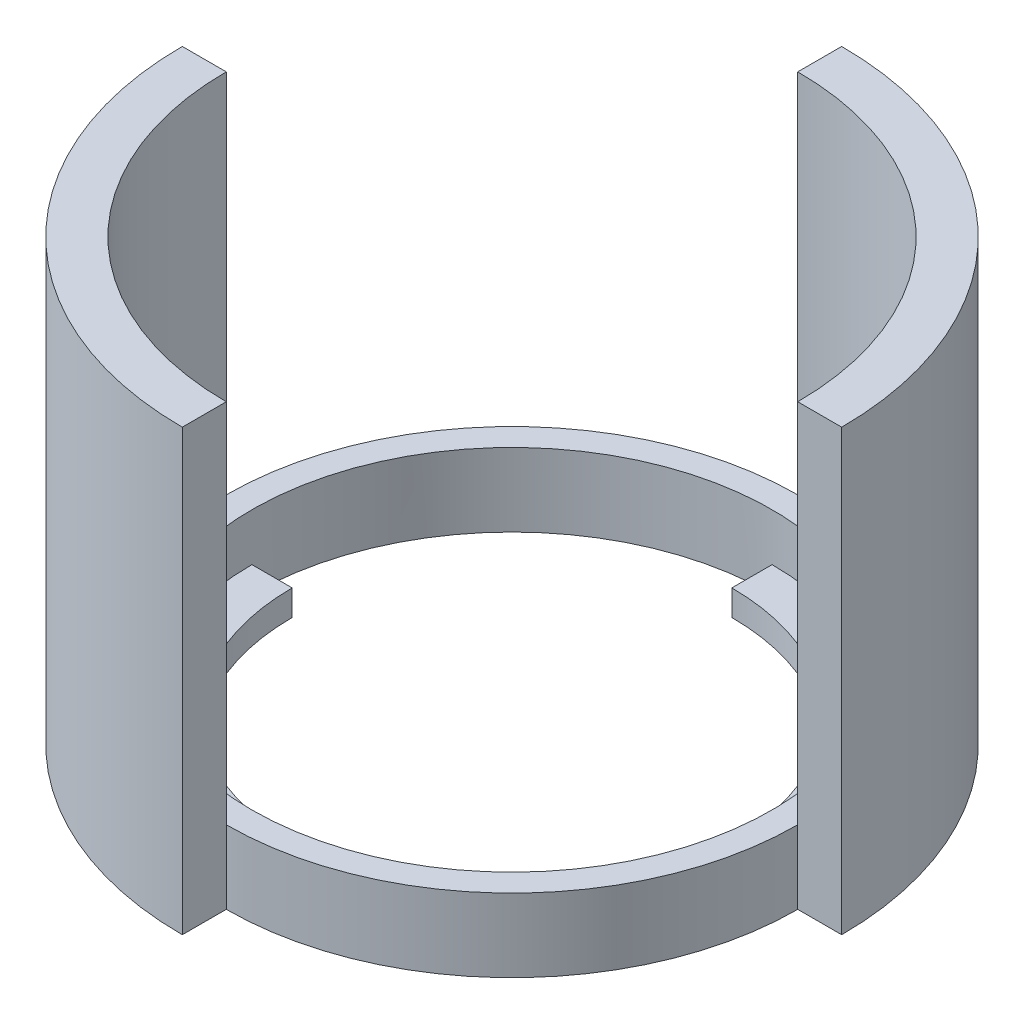
ISO-10303-21;
HEADER;
FILE_DESCRIPTION(('STEP AP214'),'2;1');
FILE_NAME('part.step','',(''),(''),'','','');
FILE_SCHEMA(('AUTOMOTIVE_DESIGN { 1 0 10303 214 1 1 1 1 }'));
ENDSEC;
DATA;
#1=APPLICATION_CONTEXT('core data for automotive mechanical design processes');
#2=APPLICATION_PROTOCOL_DEFINITION('international standard','automotive_design',2000,#1);
#3=PRODUCT_CONTEXT('',#1,'mechanical');
#4=PRODUCT('Part','Part','',(#3));
#5=PRODUCT_RELATED_PRODUCT_CATEGORY('part','',(#4));
#6=PRODUCT_DEFINITION_FORMATION('','',#4);
#7=PRODUCT_DEFINITION_CONTEXT('part definition',#1,'design');
#8=PRODUCT_DEFINITION('design','',#6,#7);
#9=PRODUCT_DEFINITION_SHAPE('','',#8);
#10=(LENGTH_UNIT() NAMED_UNIT(*) SI_UNIT(.MILLI.,.METRE.));
#11=(NAMED_UNIT(*) PLANE_ANGLE_UNIT() SI_UNIT($,.RADIAN.));
#12=(NAMED_UNIT(*) SI_UNIT($,.STERADIAN.) SOLID_ANGLE_UNIT());
#13=UNCERTAINTY_MEASURE_WITH_UNIT(LENGTH_MEASURE(1.E-05),#10,'distance_accuracy_value','');
#14=(GEOMETRIC_REPRESENTATION_CONTEXT(3) GLOBAL_UNCERTAINTY_ASSIGNED_CONTEXT((#13)) GLOBAL_UNIT_ASSIGNED_CONTEXT((#10,
#11,#12)) REPRESENTATION_CONTEXT('',''));
#15=CARTESIAN_POINT('',(0.,0.,0.));
#16=DIRECTION('',(0.,0.,1.));
#17=DIRECTION('',(1.,0.,0.));
#18=AXIS2_PLACEMENT_3D('',#15,#16,#17);
#19=CARTESIAN_POINT('',(0.,-5.,0.));
#20=DIRECTION('',(0.,1.,0.));
#21=DIRECTION('',(0.,0.,1.));
#22=AXIS2_PLACEMENT_3D('',#19,#20,#21);
#23=CYLINDRICAL_SURFACE('',#22,35.5);
#24=CARTESIAN_POINT('',(0.,5.,0.));
#25=DIRECTION('',(0.,1.,0.));
#26=DIRECTION('',(0.,0.,1.));
#27=AXIS2_PLACEMENT_3D('',#24,#25,#26);
#28=CIRCLE('',#27,35.5);
#29=CARTESIAN_POINT('',(0.,5.,35.5));
#30=VERTEX_POINT('',#29);
#31=EDGE_CURVE('E316',#30,#30,#28,.T.);
#32=ORIENTED_EDGE('',*,*,#31,.T.);
#33=EDGE_LOOP('',(#32));
#34=FACE_BOUND('',#33,.T.);
#35=DIRECTION('',(0.,-1.,0.));
#36=VECTOR('',#35,1.);
#37=CARTESIAN_POINT('',(35.5,-1.5,0.));
#38=LINE('',#37,#36);
#39=CARTESIAN_POINT('',(35.5,-1.5,0.));
#40=VERTEX_POINT('',#39);
#41=CARTESIAN_POINT('',(35.5,-5.,0.));
#42=VERTEX_POINT('',#41);
#43=EDGE_CURVE('E236',#40,#42,#38,.T.);
#44=ORIENTED_EDGE('',*,*,#43,.T.);
#45=CARTESIAN_POINT('',(0.,-5.,0.));
#46=DIRECTION('',(0.,1.,0.));
#47=DIRECTION('',(0.,0.,1.));
#48=AXIS2_PLACEMENT_3D('',#45,#46,#47);
#49=CIRCLE('',#48,35.5);
#50=CARTESIAN_POINT('',(-1.23947587528931E-13,-5.,35.5));
#51=VERTEX_POINT('',#50);
#52=EDGE_CURVE('E324',#51,#42,#49,.T.);
#53=ORIENTED_EDGE('',*,*,#52,.F.);
#54=DIRECTION('',(0.,-1.,0.));
#55=VECTOR('',#54,1.);
#56=CARTESIAN_POINT('',(-1.23947587528931E-13,-1.5,35.5));
#57=LINE('',#56,#55);
#58=CARTESIAN_POINT('',(-1.23947587528931E-13,-1.5,35.5));
#59=VERTEX_POINT('',#58);
#60=EDGE_CURVE('E320',#59,#51,#57,.T.);
#61=ORIENTED_EDGE('',*,*,#60,.F.);
#62=CARTESIAN_POINT('',(0.,-1.5,0.));
#63=DIRECTION('',(0.,-1.,0.));
#64=DIRECTION('',(0.,0.,-1.));
#65=AXIS2_PLACEMENT_3D('',#62,#63,#64);
#66=CIRCLE('',#65,35.5);
#67=CARTESIAN_POINT('',(-17.7499999999998,-1.5,30.7439018343477));
#68=VERTEX_POINT('',#67);
#69=EDGE_CURVE('E302',#68,#59,#66,.F.);
#70=ORIENTED_EDGE('',*,*,#69,.F.);
#71=DIRECTION('',(0.,-1.,0.));
#72=VECTOR('',#71,1.);
#73=CARTESIAN_POINT('',(-17.7499999999998,-1.5,30.7439018343477));
#74=LINE('',#73,#72);
#75=CARTESIAN_POINT('',(-17.7499999999998,-5.,30.7439018343477));
#76=VERTEX_POINT('',#75);
#77=EDGE_CURVE('E317',#68,#76,#74,.T.);
#78=ORIENTED_EDGE('',*,*,#77,.T.);
#79=CARTESIAN_POINT('',(-30.7439018343476,-5.,17.75));
#80=VERTEX_POINT('',#79);
#81=EDGE_CURVE('E329',#80,#76,#49,.T.);
#82=ORIENTED_EDGE('',*,*,#81,.F.);
#83=DIRECTION('',(0.,-1.,0.));
#84=VECTOR('',#83,1.);
#85=CARTESIAN_POINT('',(-30.7439018343475,-1.5,17.75));
#86=LINE('',#85,#84);
#87=CARTESIAN_POINT('',(-30.7439018343475,-1.5,17.75));
#88=VERTEX_POINT('',#87);
#89=EDGE_CURVE('E291',#88,#80,#86,.T.);
#90=ORIENTED_EDGE('',*,*,#89,.F.);
#91=CARTESIAN_POINT('',(0.,-1.5,0.));
#92=DIRECTION('',(0.,-1.,0.));
#93=DIRECTION('',(0.,0.,-1.));
#94=AXIS2_PLACEMENT_3D('',#91,#92,#93);
#95=CIRCLE('',#94,35.5);
#96=CARTESIAN_POINT('',(-35.5,-1.5,0.));
#97=VERTEX_POINT('',#96);
#98=EDGE_CURVE('E273',#97,#88,#95,.F.);
#99=ORIENTED_EDGE('',*,*,#98,.F.);
#100=DIRECTION('',(0.,-1.,0.));
#101=VECTOR('',#100,1.);
#102=CARTESIAN_POINT('',(-35.5,-1.5,0.));
#103=LINE('',#102,#101);
#104=CARTESIAN_POINT('',(-35.5,-5.,0.));
#105=VERTEX_POINT('',#104);
#106=EDGE_CURVE('E288',#97,#105,#103,.T.);
#107=ORIENTED_EDGE('',*,*,#106,.T.);
#108=CARTESIAN_POINT('',(0.,-5.,-35.5));
#109=VERTEX_POINT('',#108);
#110=EDGE_CURVE('E772',#109,#105,#49,.T.);
#111=ORIENTED_EDGE('',*,*,#110,.F.);
#112=DIRECTION('',(0.,-1.,0.));
#113=VECTOR('',#112,1.);
#114=CARTESIAN_POINT('',(0.,-1.5,-35.5));
#115=LINE('',#114,#113);
#116=CARTESIAN_POINT('',(0.,-1.5,-35.5));
#117=VERTEX_POINT('',#116);
#118=EDGE_CURVE('E263',#117,#109,#115,.T.);
#119=ORIENTED_EDGE('',*,*,#118,.F.);
#120=CARTESIAN_POINT('',(0.,-1.5,0.));
#121=DIRECTION('',(0.,-1.,0.));
#122=DIRECTION('',(0.,0.,-1.));
#123=AXIS2_PLACEMENT_3D('',#120,#121,#122);
#124=CIRCLE('',#123,35.5);
#125=CARTESIAN_POINT('',(17.7499999999998,-1.5,-30.7439018343477));
#126=VERTEX_POINT('',#125);
#127=EDGE_CURVE('E246',#126,#117,#124,.F.);
#128=ORIENTED_EDGE('',*,*,#127,.F.);
#129=DIRECTION('',(0.,-1.,0.));
#130=VECTOR('',#129,1.);
#131=CARTESIAN_POINT('',(17.7499999999998,-1.5,-30.7439018343477));
#132=LINE('',#131,#130);
#133=CARTESIAN_POINT('',(17.7499999999998,-5.,-30.7439018343477));
#134=VERTEX_POINT('',#133);
#135=EDGE_CURVE('E260',#126,#134,#132,.T.);
#136=ORIENTED_EDGE('',*,*,#135,.T.);
#137=CARTESIAN_POINT('',(30.7439018343476,-5.,-17.75));
#138=VERTEX_POINT('',#137);
#139=EDGE_CURVE('E328',#138,#134,#49,.T.);
#140=ORIENTED_EDGE('',*,*,#139,.F.);
#141=DIRECTION('',(0.,-1.,0.));
#142=VECTOR('',#141,1.);
#143=CARTESIAN_POINT('',(30.7439018343476,-1.5,-17.75));
#144=LINE('',#143,#142);
#145=CARTESIAN_POINT('',(30.7439018343476,-1.5,-17.75));
#146=VERTEX_POINT('',#145);
#147=EDGE_CURVE('E211',#146,#138,#144,.T.);
#148=ORIENTED_EDGE('',*,*,#147,.F.);
#149=CARTESIAN_POINT('',(0.,-1.5,0.));
#150=DIRECTION('',(0.,-1.,0.));
#151=DIRECTION('',(0.,0.,-1.));
#152=AXIS2_PLACEMENT_3D('',#149,#150,#151);
#153=CIRCLE('',#152,35.5);
#154=EDGE_CURVE('E225',#40,#146,#153,.F.);
#155=ORIENTED_EDGE('',*,*,#154,.F.);
#156=EDGE_LOOP('',(#44,#53,#61,#70,#78,#82,#90,#99,#107,#111,#119,#128,#136,#140,#148,#155));
#157=FACE_BOUND('',#156,.T.);
#158=ADVANCED_FACE('F31',(#34,#157),#23,.F.);
#159=CARTESIAN_POINT('',(0.,5.,0.));
#160=DIRECTION('',(0.,-1.,0.));
#161=DIRECTION('',(0.,0.,-1.));
#162=AXIS2_PLACEMENT_3D('',#159,#160,#161);
#163=CYLINDRICAL_SURFACE('',#162,39.);
#164=DIRECTION('',(0.,-1.,0.));
#165=VECTOR('',#164,1.);
#166=CARTESIAN_POINT('',(39.,55.,0.));
#167=LINE('',#166,#165);
#168=CARTESIAN_POINT('',(39.,5.,0.));
#169=VERTEX_POINT('',#168);
#170=CARTESIAN_POINT('',(39.,-5.,0.));
#171=VERTEX_POINT('',#170);
#172=EDGE_CURVE('E365',#169,#171,#167,.T.);
#173=ORIENTED_EDGE('',*,*,#172,.F.);
#174=CARTESIAN_POINT('',(0.,5.,0.));
#175=DIRECTION('',(0.,1.,0.));
#176=DIRECTION('',(0.,0.,1.));
#177=AXIS2_PLACEMENT_3D('',#174,#175,#176);
#178=CIRCLE('',#177,39.);
#179=CARTESIAN_POINT('',(0.,5.,39.));
#180=VERTEX_POINT('',#179);
#181=EDGE_CURVE('E11',#180,#169,#178,.T.);
#182=ORIENTED_EDGE('',*,*,#181,.F.);
#183=DIRECTION('',(0.,1.,0.));
#184=VECTOR('',#183,1.);
#185=CARTESIAN_POINT('',(0.,0.,39.));
#186=LINE('',#185,#184);
#187=CARTESIAN_POINT('',(0.,-5.,39.));
#188=VERTEX_POINT('',#187);
#189=EDGE_CURVE('E398',#188,#180,#186,.T.);
#190=ORIENTED_EDGE('',*,*,#189,.F.);
#191=CARTESIAN_POINT('',(0.,-5.,0.));
#192=DIRECTION('',(0.,-1.,0.));
#193=DIRECTION('',(0.,0.,-1.));
#194=AXIS2_PLACEMENT_3D('',#191,#192,#193);
#195=CIRCLE('',#194,39.);
#196=EDGE_CURVE('E349',#171,#188,#195,.T.);
#197=ORIENTED_EDGE('',*,*,#196,.F.);
#198=EDGE_LOOP('',(#173,#182,#190,#197));
#199=FACE_BOUND('',#198,.T.);
#200=ADVANCED_FACE('F33',(#199),#163,.T.);
#201=DIRECTION('',(0.,-1.,0.));
#202=VECTOR('',#201,1.);
#203=CARTESIAN_POINT('',(0.,55.,-39.));
#204=LINE('',#203,#202);
#205=CARTESIAN_POINT('',(0.,5.,-39.));
#206=VERTEX_POINT('',#205);
#207=CARTESIAN_POINT('',(0.,-5.,-39.));
#208=VERTEX_POINT('',#207);
#209=EDGE_CURVE('E369',#206,#208,#204,.T.);
#210=ORIENTED_EDGE('',*,*,#209,.T.);
#211=CARTESIAN_POINT('',(0.,-5.,0.));
#212=DIRECTION('',(0.,-1.,0.));
#213=DIRECTION('',(0.,0.,-1.));
#214=AXIS2_PLACEMENT_3D('',#211,#212,#213);
#215=CIRCLE('',#214,39.);
#216=CARTESIAN_POINT('',(-39.,-5.,0.));
#217=VERTEX_POINT('',#216);
#218=EDGE_CURVE('E337',#217,#208,#215,.T.);
#219=ORIENTED_EDGE('',*,*,#218,.F.);
#220=DIRECTION('',(0.,1.,0.));
#221=VECTOR('',#220,1.);
#222=CARTESIAN_POINT('',(-39.,0.,0.));
#223=LINE('',#222,#221);
#224=CARTESIAN_POINT('',(-39.,5.,0.));
#225=VERTEX_POINT('',#224);
#226=EDGE_CURVE('E393',#217,#225,#223,.T.);
#227=ORIENTED_EDGE('',*,*,#226,.T.);
#228=EDGE_CURVE('E39',#206,#225,#178,.T.);
#229=ORIENTED_EDGE('',*,*,#228,.F.);
#230=EDGE_LOOP('',(#210,#219,#227,#229));
#231=FACE_BOUND('',#230,.T.);
#232=ADVANCED_FACE('F412',(#231),#163,.T.);
#233=CARTESIAN_POINT('',(0.,5.,0.));
#234=DIRECTION('',(0.,1.,0.));
#235=DIRECTION('',(0.,0.,1.));
#236=AXIS2_PLACEMENT_3D('',#233,#234,#235);
#237=PLANE('',#236);
#238=ORIENTED_EDGE('',*,*,#31,.F.);
#239=EDGE_LOOP('',(#238));
#240=FACE_BOUND('',#239,.T.);
#241=ORIENTED_EDGE('',*,*,#181,.T.);
#242=CARTESIAN_POINT('',(0.,5.,0.));
#243=DIRECTION('',(0.,1.,0.));
#244=DIRECTION('',(0.,0.,1.));
#245=AXIS2_PLACEMENT_3D('',#242,#243,#244);
#246=CIRCLE('',#245,39.);
#247=EDGE_CURVE('E377',#206,#169,#246,.F.);
#248=ORIENTED_EDGE('',*,*,#247,.F.);
#249=ORIENTED_EDGE('',*,*,#228,.T.);
#250=CARTESIAN_POINT('',(0.,5.,0.));
#251=DIRECTION('',(0.,1.,0.));
#252=DIRECTION('',(0.,0.,1.));
#253=AXIS2_PLACEMENT_3D('',#250,#251,#252);
#254=CIRCLE('',#253,39.);
#255=EDGE_CURVE('E396',#225,#180,#254,.T.);
#256=ORIENTED_EDGE('',*,*,#255,.T.);
#257=EDGE_LOOP('',(#241,#248,#249,#256));
#258=FACE_BOUND('',#257,.T.);
#259=ADVANCED_FACE('F408',(#240,#258),#237,.T.);
#260=CARTESIAN_POINT('',(-99.1414213562373,0.,0.));
#261=DIRECTION('',(0.,0.,1.));
#262=DIRECTION('',(1.,0.,0.));
#263=AXIS2_PLACEMENT_3D('',#260,#261,#262);
#264=PLANE('',#263);
#265=DIRECTION('',(1.,0.,0.));
#266=VECTOR('',#265,1.);
#267=CARTESIAN_POINT('',(-99.1414213562373,55.,0.));
#268=LINE('',#267,#266);
#269=CARTESIAN_POINT('',(-45.,55.,0.));
#270=VERTEX_POINT('',#269);
#271=CARTESIAN_POINT('',(-39.,55.,0.));
#272=VERTEX_POINT('',#271);
#273=EDGE_CURVE('E380',#270,#272,#268,.T.);
#274=ORIENTED_EDGE('',*,*,#273,.T.);
#275=EDGE_CURVE('E397',#225,#272,#223,.T.);
#276=ORIENTED_EDGE('',*,*,#275,.F.);
#277=ORIENTED_EDGE('',*,*,#226,.F.);
#278=DIRECTION('',(1.,0.,0.));
#279=VECTOR('',#278,1.);
#280=CARTESIAN_POINT('',(-45.,-5.,0.));
#281=LINE('',#280,#279);
#282=CARTESIAN_POINT('',(-45.,-5.,0.));
#283=VERTEX_POINT('',#282);
#284=EDGE_CURVE('E334',#283,#217,#281,.T.);
#285=ORIENTED_EDGE('',*,*,#284,.F.);
#286=DIRECTION('',(0.,1.,0.));
#287=VECTOR('',#286,1.);
#288=CARTESIAN_POINT('',(-45.,0.,0.));
#289=LINE('',#288,#287);
#290=EDGE_CURVE('E392',#283,#270,#289,.T.);
#291=ORIENTED_EDGE('',*,*,#290,.T.);
#292=EDGE_LOOP('',(#274,#276,#277,#285,#291));
#293=FACE_BOUND('',#292,.T.);
#294=ADVANCED_FACE('F419',(#293),#264,.F.);
#295=CARTESIAN_POINT('',(0.,0.,0.));
#296=DIRECTION('',(0.,1.,0.));
#297=DIRECTION('',(0.,0.,1.));
#298=AXIS2_PLACEMENT_3D('',#295,#296,#297);
#299=CYLINDRICAL_SURFACE('',#298,39.);
#300=ORIENTED_EDGE('',*,*,#255,.F.);
#301=ORIENTED_EDGE('',*,*,#275,.T.);
#302=CARTESIAN_POINT('',(0.,55.,0.));
#303=DIRECTION('',(0.,1.,0.));
#304=DIRECTION('',(0.,0.,1.));
#305=AXIS2_PLACEMENT_3D('',#302,#303,#304);
#306=CIRCLE('',#305,39.);
#307=CARTESIAN_POINT('',(0.,55.,39.));
#308=VERTEX_POINT('',#307);
#309=EDGE_CURVE('E389',#272,#308,#306,.T.);
#310=ORIENTED_EDGE('',*,*,#309,.T.);
#311=EDGE_CURVE('E401',#180,#308,#186,.T.);
#312=ORIENTED_EDGE('',*,*,#311,.F.);
#313=EDGE_LOOP('',(#300,#301,#310,#312));
#314=FACE_BOUND('',#313,.T.);
#315=ADVANCED_FACE('F418',(#314),#299,.F.);
#316=CARTESIAN_POINT('',(0.,0.,0.));
#317=DIRECTION('',(-1.,0.,0.));
#318=DIRECTION('',(0.,0.,1.));
#319=AXIS2_PLACEMENT_3D('',#316,#317,#318);
#320=PLANE('',#319);
#321=DIRECTION('',(0.,0.,1.));
#322=VECTOR('',#321,1.);
#323=CARTESIAN_POINT('',(0.,55.,0.));
#324=LINE('',#323,#322);
#325=CARTESIAN_POINT('',(0.,55.,45.));
#326=VERTEX_POINT('',#325);
#327=EDGE_CURVE('E386',#308,#326,#324,.T.);
#328=ORIENTED_EDGE('',*,*,#327,.T.);
#329=DIRECTION('',(0.,1.,0.));
#330=VECTOR('',#329,1.);
#331=CARTESIAN_POINT('',(0.,0.,45.));
#332=LINE('',#331,#330);
#333=CARTESIAN_POINT('',(0.,-5.,45.));
#334=VERTEX_POINT('',#333);
#335=EDGE_CURVE('E402',#334,#326,#332,.T.);
#336=ORIENTED_EDGE('',*,*,#335,.F.);
#337=DIRECTION('',(0.,0.,1.));
#338=VECTOR('',#337,1.);
#339=CARTESIAN_POINT('',(0.,-5.,45.));
#340=LINE('',#339,#338);
#341=EDGE_CURVE('E352',#188,#334,#340,.T.);
#342=ORIENTED_EDGE('',*,*,#341,.F.);
#343=ORIENTED_EDGE('',*,*,#189,.T.);
#344=ORIENTED_EDGE('',*,*,#311,.T.);
#345=EDGE_LOOP('',(#328,#336,#342,#343,#344));
#346=FACE_BOUND('',#345,.T.);
#347=ADVANCED_FACE('F427',(#346),#320,.F.);
#348=CARTESIAN_POINT('',(0.,0.,0.));
#349=DIRECTION('',(0.,1.,0.));
#350=DIRECTION('',(0.,0.,1.));
#351=AXIS2_PLACEMENT_3D('',#348,#349,#350);
#352=CYLINDRICAL_SURFACE('',#351,45.);
#353=CARTESIAN_POINT('',(0.,55.,0.));
#354=DIRECTION('',(0.,1.,0.));
#355=DIRECTION('',(0.,0.,1.));
#356=AXIS2_PLACEMENT_3D('',#353,#354,#355);
#357=CIRCLE('',#356,45.);
#358=EDGE_CURVE('E383',#270,#326,#357,.T.);
#359=ORIENTED_EDGE('',*,*,#358,.F.);
#360=ORIENTED_EDGE('',*,*,#290,.F.);
#361=CARTESIAN_POINT('',(0.,-5.,0.));
#362=DIRECTION('',(0.,-1.,0.));
#363=DIRECTION('',(0.,0.,-1.));
#364=AXIS2_PLACEMENT_3D('',#361,#362,#363);
#365=CIRCLE('',#364,45.);
#366=EDGE_CURVE('E327',#334,#283,#365,.T.);
#367=ORIENTED_EDGE('',*,*,#366,.F.);
#368=ORIENTED_EDGE('',*,*,#335,.T.);
#369=EDGE_LOOP('',(#359,#360,#367,#368));
#370=FACE_BOUND('',#369,.T.);
#371=ADVANCED_FACE('F449',(#370),#352,.T.);
#372=CARTESIAN_POINT('',(-99.1414213562373,55.,0.));
#373=DIRECTION('',(0.,1.,0.));
#374=DIRECTION('',(0.,0.,1.));
#375=AXIS2_PLACEMENT_3D('',#372,#373,#374);
#376=PLANE('',#375);
#377=ORIENTED_EDGE('',*,*,#273,.F.);
#378=ORIENTED_EDGE('',*,*,#358,.T.);
#379=ORIENTED_EDGE('',*,*,#327,.F.);
#380=ORIENTED_EDGE('',*,*,#309,.F.);
#381=EDGE_LOOP('',(#377,#378,#379,#380));
#382=FACE_BOUND('',#381,.T.);
#383=ADVANCED_FACE('F425',(#382),#376,.T.);
#384=CARTESIAN_POINT('',(-99.1414213562373,55.,0.));
#385=DIRECTION('',(0.,0.,-1.));
#386=DIRECTION('',(-1.,0.,0.));
#387=AXIS2_PLACEMENT_3D('',#384,#385,#386);
#388=PLANE('',#387);
#389=CARTESIAN_POINT('',(39.,55.,0.));
#390=VERTEX_POINT('',#389);
#391=EDGE_CURVE('E366',#390,#169,#167,.T.);
#392=ORIENTED_EDGE('',*,*,#391,.T.);
#393=ORIENTED_EDGE('',*,*,#172,.T.);
#394=DIRECTION('',(-1.,0.,0.));
#395=VECTOR('',#394,1.);
#396=CARTESIAN_POINT('',(39.,-5.,0.));
#397=LINE('',#396,#395);
#398=CARTESIAN_POINT('',(45.,-5.,0.));
#399=VERTEX_POINT('',#398);
#400=EDGE_CURVE('E346',#399,#171,#397,.T.);
#401=ORIENTED_EDGE('',*,*,#400,.F.);
#402=DIRECTION('',(0.,-1.,0.));
#403=VECTOR('',#402,1.);
#404=CARTESIAN_POINT('',(45.,55.,0.));
#405=LINE('',#404,#403);
#406=CARTESIAN_POINT('',(45.,55.,0.));
#407=VERTEX_POINT('',#406);
#408=EDGE_CURVE('E375',#407,#399,#405,.T.);
#409=ORIENTED_EDGE('',*,*,#408,.F.);
#410=DIRECTION('',(1.,0.,0.));
#411=VECTOR('',#410,1.);
#412=CARTESIAN_POINT('',(-99.1414213562373,55.,0.));
#413=LINE('',#412,#411);
#414=EDGE_CURVE('E355',#390,#407,#413,.T.);
#415=ORIENTED_EDGE('',*,*,#414,.F.);
#416=EDGE_LOOP('',(#392,#393,#401,#409,#415));
#417=FACE_BOUND('',#416,.T.);
#418=ADVANCED_FACE('F438',(#417),#388,.F.);
#419=CARTESIAN_POINT('',(0.,55.,0.));
#420=DIRECTION('',(0.,-1.,0.));
#421=DIRECTION('',(0.,0.,-1.));
#422=AXIS2_PLACEMENT_3D('',#419,#420,#421);
#423=CYLINDRICAL_SURFACE('',#422,45.);
#424=ORIENTED_EDGE('',*,*,#408,.T.);
#425=CARTESIAN_POINT('',(0.,-5.,0.));
#426=DIRECTION('',(0.,-1.,0.));
#427=DIRECTION('',(0.,0.,-1.));
#428=AXIS2_PLACEMENT_3D('',#425,#426,#427);
#429=CIRCLE('',#428,45.);
#430=CARTESIAN_POINT('',(0.,-5.,-45.));
#431=VERTEX_POINT('',#430);
#432=EDGE_CURVE('E343',#431,#399,#429,.T.);
#433=ORIENTED_EDGE('',*,*,#432,.F.);
#434=DIRECTION('',(0.,-1.,0.));
#435=VECTOR('',#434,1.);
#436=CARTESIAN_POINT('',(0.,55.,-45.));
#437=LINE('',#436,#435);
#438=CARTESIAN_POINT('',(0.,55.,-45.));
#439=VERTEX_POINT('',#438);
#440=EDGE_CURVE('E373',#439,#431,#437,.T.);
#441=ORIENTED_EDGE('',*,*,#440,.F.);
#442=CARTESIAN_POINT('',(0.,55.,0.));
#443=DIRECTION('',(0.,1.,0.));
#444=DIRECTION('',(0.,0.,1.));
#445=AXIS2_PLACEMENT_3D('',#442,#443,#444);
#446=CIRCLE('',#445,45.);
#447=EDGE_CURVE('E358',#407,#439,#446,.T.);
#448=ORIENTED_EDGE('',*,*,#447,.F.);
#449=EDGE_LOOP('',(#424,#433,#441,#448));
#450=FACE_BOUND('',#449,.T.);
#451=ADVANCED_FACE('F480',(#450),#423,.T.);
#452=CARTESIAN_POINT('',(0.,55.,0.));
#453=DIRECTION('',(1.,0.,0.));
#454=DIRECTION('',(0.,0.,-1.));
#455=AXIS2_PLACEMENT_3D('',#452,#453,#454);
#456=PLANE('',#455);
#457=ORIENTED_EDGE('',*,*,#440,.T.);
#458=DIRECTION('',(0.,0.,-1.));
#459=VECTOR('',#458,1.);
#460=CARTESIAN_POINT('',(0.,-5.,-39.));
#461=LINE('',#460,#459);
#462=EDGE_CURVE('E340',#208,#431,#461,.T.);
#463=ORIENTED_EDGE('',*,*,#462,.F.);
#464=ORIENTED_EDGE('',*,*,#209,.F.);
#465=CARTESIAN_POINT('',(0.,55.,-39.));
#466=VERTEX_POINT('',#465);
#467=EDGE_CURVE('E370',#466,#206,#204,.T.);
#468=ORIENTED_EDGE('',*,*,#467,.F.);
#469=DIRECTION('',(0.,0.,1.));
#470=VECTOR('',#469,1.);
#471=CARTESIAN_POINT('',(0.,55.,0.));
#472=LINE('',#471,#470);
#473=EDGE_CURVE('E360',#439,#466,#472,.T.);
#474=ORIENTED_EDGE('',*,*,#473,.F.);
#475=EDGE_LOOP('',(#457,#463,#464,#468,#474));
#476=FACE_BOUND('',#475,.T.);
#477=ADVANCED_FACE('F446',(#476),#456,.F.);
#478=CARTESIAN_POINT('',(0.,55.,0.));
#479=DIRECTION('',(0.,-1.,0.));
#480=DIRECTION('',(0.,0.,-1.));
#481=AXIS2_PLACEMENT_3D('',#478,#479,#480);
#482=CYLINDRICAL_SURFACE('',#481,39.);
#483=ORIENTED_EDGE('',*,*,#467,.T.);
#484=ORIENTED_EDGE('',*,*,#247,.T.);
#485=ORIENTED_EDGE('',*,*,#391,.F.);
#486=CARTESIAN_POINT('',(0.,55.,0.));
#487=DIRECTION('',(0.,1.,0.));
#488=DIRECTION('',(0.,0.,1.));
#489=AXIS2_PLACEMENT_3D('',#486,#487,#488);
#490=CIRCLE('',#489,39.);
#491=EDGE_CURVE('E362',#390,#466,#490,.T.);
#492=ORIENTED_EDGE('',*,*,#491,.T.);
#493=EDGE_LOOP('',(#483,#484,#485,#492));
#494=FACE_BOUND('',#493,.T.);
#495=ADVANCED_FACE('F441',(#494),#482,.F.);
#496=CARTESIAN_POINT('',(-99.1414213562373,55.,0.));
#497=DIRECTION('',(0.,1.,0.));
#498=DIRECTION('',(0.,0.,1.));
#499=AXIS2_PLACEMENT_3D('',#496,#497,#498);
#500=PLANE('',#499);
#501=ORIENTED_EDGE('',*,*,#414,.T.);
#502=ORIENTED_EDGE('',*,*,#447,.T.);
#503=ORIENTED_EDGE('',*,*,#473,.T.);
#504=ORIENTED_EDGE('',*,*,#491,.F.);
#505=EDGE_LOOP('',(#501,#502,#503,#504));
#506=FACE_BOUND('',#505,.T.);
#507=ADVANCED_FACE('F472',(#506),#500,.T.);
#508=CARTESIAN_POINT('',(0.,-5.,0.));
#509=DIRECTION('',(0.,-1.,0.));
#510=DIRECTION('',(0.,0.,-1.));
#511=AXIS2_PLACEMENT_3D('',#508,#509,#510);
#512=PLANE('',#511);
#513=ORIENTED_EDGE('',*,*,#52,.T.);
#514=DIRECTION('',(1.,0.,0.));
#515=VECTOR('',#514,1.);
#516=CARTESIAN_POINT('',(0.,-5.,0.));
#517=LINE('',#516,#515);
#518=CARTESIAN_POINT('',(30.,-5.,0.));
#519=VERTEX_POINT('',#518);
#520=EDGE_CURVE('E221',#519,#42,#517,.T.);
#521=ORIENTED_EDGE('',*,*,#520,.F.);
#522=CARTESIAN_POINT('',(0.,-5.,0.));
#523=DIRECTION('',(0.,-1.,0.));
#524=DIRECTION('',(0.,0.,-1.));
#525=AXIS2_PLACEMENT_3D('',#522,#523,#524);
#526=CIRCLE('',#525,30.);
#527=CARTESIAN_POINT('',(25.9807621135332,-5.,-15.));
#528=VERTEX_POINT('',#527);
#529=EDGE_CURVE('E230',#528,#519,#526,.T.);
#530=ORIENTED_EDGE('',*,*,#529,.F.);
#531=DIRECTION('',(0.866025403784436,0.,-0.500000000000004));
#532=VECTOR('',#531,1.);
#533=CARTESIAN_POINT('',(42.9294947308996,-5.,-24.7853553390596));
#534=LINE('',#533,#532);
#535=EDGE_CURVE('E46',#528,#138,#534,.T.);
#536=ORIENTED_EDGE('',*,*,#535,.T.);
#537=ORIENTED_EDGE('',*,*,#139,.T.);
#538=DIRECTION('',(0.499999999999995,0.,-0.866025403784442));
#539=VECTOR('',#538,1.);
#540=CARTESIAN_POINT('',(42.929494730899,-5.,-74.3560660171785));
#541=LINE('',#540,#539);
#542=CARTESIAN_POINT('',(14.9999999999998,-5.,-25.9807621135332));
#543=VERTEX_POINT('',#542);
#544=EDGE_CURVE('E244',#543,#134,#541,.T.);
#545=ORIENTED_EDGE('',*,*,#544,.F.);
#546=CARTESIAN_POINT('',(0.,-5.,0.));
#547=DIRECTION('',(0.,-1.,0.));
#548=DIRECTION('',(0.,0.,-1.));
#549=AXIS2_PLACEMENT_3D('',#546,#547,#548);
#550=CIRCLE('',#549,30.);
#551=CARTESIAN_POINT('',(0.,-5.,-30.));
#552=VERTEX_POINT('',#551);
#553=EDGE_CURVE('E235',#552,#543,#550,.T.);
#554=ORIENTED_EDGE('',*,*,#553,.F.);
#555=DIRECTION('',(0.,0.,1.));
#556=VECTOR('',#555,1.);
#557=CARTESIAN_POINT('',(0.,-5.,-99.1414213562373));
#558=LINE('',#557,#556);
#559=EDGE_CURVE('E53',#109,#552,#558,.T.);
#560=ORIENTED_EDGE('',*,*,#559,.F.);
#561=ORIENTED_EDGE('',*,*,#110,.T.);
#562=DIRECTION('',(1.,0.,0.));
#563=VECTOR('',#562,1.);
#564=CARTESIAN_POINT('',(0.,-5.,0.));
#565=LINE('',#564,#563);
#566=CARTESIAN_POINT('',(-30.,-5.,0.));
#567=VERTEX_POINT('',#566);
#568=EDGE_CURVE('E270',#105,#567,#565,.T.);
#569=ORIENTED_EDGE('',*,*,#568,.T.);
#570=CARTESIAN_POINT('',(0.,-5.,0.));
#571=DIRECTION('',(0.,-1.,0.));
#572=DIRECTION('',(0.,0.,-1.));
#573=AXIS2_PLACEMENT_3D('',#570,#571,#572);
#574=CIRCLE('',#573,30.);
#575=CARTESIAN_POINT('',(-25.9807621135331,-5.,15.));
#576=VERTEX_POINT('',#575);
#577=EDGE_CURVE('E259',#576,#567,#574,.T.);
#578=ORIENTED_EDGE('',*,*,#577,.F.);
#579=DIRECTION('',(-0.866025403784438,0.,0.500000000000001));
#580=VECTOR('',#579,1.);
#581=CARTESIAN_POINT('',(42.9294947308993,-5.,-24.7853553390595));
#582=LINE('',#581,#580);
#583=EDGE_CURVE('E281',#576,#80,#582,.T.);
#584=ORIENTED_EDGE('',*,*,#583,.T.);
#585=ORIENTED_EDGE('',*,*,#81,.T.);
#586=DIRECTION('',(-0.499999999999995,0.,0.866025403784442));
#587=VECTOR('',#586,1.);
#588=CARTESIAN_POINT('',(42.929494730899,-5.,-74.3560660171785));
#589=LINE('',#588,#587);
#590=CARTESIAN_POINT('',(-14.9999999999998,-5.,25.9807621135332));
#591=VERTEX_POINT('',#590);
#592=EDGE_CURVE('E299',#591,#76,#589,.T.);
#593=ORIENTED_EDGE('',*,*,#592,.F.);
#594=CARTESIAN_POINT('',(0.,-5.,0.));
#595=DIRECTION('',(0.,-1.,0.));
#596=DIRECTION('',(0.,0.,-1.));
#597=AXIS2_PLACEMENT_3D('',#594,#595,#596);
#598=CIRCLE('',#597,30.);
#599=CARTESIAN_POINT('',(-1.04744440165294E-13,-5.,30.));
#600=VERTEX_POINT('',#599);
#601=EDGE_CURVE('E287',#600,#591,#598,.T.);
#602=ORIENTED_EDGE('',*,*,#601,.F.);
#603=DIRECTION('',(0.,0.,1.));
#604=VECTOR('',#603,1.);
#605=CARTESIAN_POINT('',(3.46150422571687E-13,-5.,-99.1414213562373));
#606=LINE('',#605,#604);
#607=EDGE_CURVE('E309',#600,#51,#606,.T.);
#608=ORIENTED_EDGE('',*,*,#607,.T.);
#609=EDGE_LOOP('',(#513,#521,#530,#536,#537,#545,#554,#560,#561,#569,#578,#584,#585,#593,#602,#608));
#610=FACE_BOUND('',#609,.T.);
#611=ORIENTED_EDGE('',*,*,#366,.T.);
#612=ORIENTED_EDGE('',*,*,#284,.T.);
#613=ORIENTED_EDGE('',*,*,#218,.T.);
#614=ORIENTED_EDGE('',*,*,#462,.T.);
#615=ORIENTED_EDGE('',*,*,#432,.T.);
#616=ORIENTED_EDGE('',*,*,#400,.T.);
#617=ORIENTED_EDGE('',*,*,#196,.T.);
#618=ORIENTED_EDGE('',*,*,#341,.T.);
#619=EDGE_LOOP('',(#611,#612,#613,#614,#615,#616,#617,#618));
#620=FACE_BOUND('',#619,.T.);
#621=ADVANCED_FACE('F432',(#610,#620),#512,.T.);
#622=CARTESIAN_POINT('',(0.,-1.5,0.));
#623=DIRECTION('',(0.,-1.,0.));
#624=DIRECTION('',(0.,0.,-1.));
#625=AXIS2_PLACEMENT_3D('',#622,#623,#624);
#626=CYLINDRICAL_SURFACE('',#625,30.);
#627=ORIENTED_EDGE('',*,*,#601,.T.);
#628=DIRECTION('',(0.,-1.,0.));
#629=VECTOR('',#628,1.);
#630=CARTESIAN_POINT('',(-14.9999999999998,-1.5,25.9807621135332));
#631=LINE('',#630,#629);
#632=CARTESIAN_POINT('',(-14.9999999999998,-1.5,25.9807621135332));
#633=VERTEX_POINT('',#632);
#634=EDGE_CURVE('E313',#633,#591,#631,.T.);
#635=ORIENTED_EDGE('',*,*,#634,.F.);
#636=CARTESIAN_POINT('',(0.,-1.5,0.));
#637=DIRECTION('',(0.,-1.,0.));
#638=DIRECTION('',(0.,0.,-1.));
#639=AXIS2_PLACEMENT_3D('',#636,#637,#638);
#640=CIRCLE('',#639,30.);
#641=CARTESIAN_POINT('',(-1.04744440165294E-13,-1.5,30.));
#642=VERTEX_POINT('',#641);
#643=EDGE_CURVE('E295',#642,#633,#640,.T.);
#644=ORIENTED_EDGE('',*,*,#643,.F.);
#645=DIRECTION('',(0.,-1.,0.));
#646=VECTOR('',#645,1.);
#647=CARTESIAN_POINT('',(-1.04744440165294E-13,-1.5,30.));
#648=LINE('',#647,#646);
#649=EDGE_CURVE('E306',#642,#600,#648,.T.);
#650=ORIENTED_EDGE('',*,*,#649,.T.);
#651=EDGE_LOOP('',(#627,#635,#644,#650));
#652=FACE_BOUND('',#651,.T.);
#653=ADVANCED_FACE('F468',(#652),#626,.F.);
#654=CARTESIAN_POINT('',(42.929494730899,-1.5,-74.3560660171785));
#655=DIRECTION('',(0.866025403784442,0.,0.499999999999995));
#656=DIRECTION('',(0.499999999999995,0.,-0.866025403784442));
#657=AXIS2_PLACEMENT_3D('',#654,#655,#656);
#658=PLANE('',#657);
#659=ORIENTED_EDGE('',*,*,#592,.T.);
#660=ORIENTED_EDGE('',*,*,#77,.F.);
#661=DIRECTION('',(-0.499999999999995,0.,0.866025403784442));
#662=VECTOR('',#661,1.);
#663=CARTESIAN_POINT('',(42.929494730899,-1.5,-74.3560660171785));
#664=LINE('',#663,#662);
#665=EDGE_CURVE('E304',#633,#68,#664,.T.);
#666=ORIENTED_EDGE('',*,*,#665,.F.);
#667=ORIENTED_EDGE('',*,*,#634,.T.);
#668=EDGE_LOOP('',(#659,#660,#666,#667));
#669=FACE_BOUND('',#668,.T.);
#670=ADVANCED_FACE('F602',(#669),#658,.F.);
#671=CARTESIAN_POINT('',(3.46150422571687E-13,-1.5,-99.1414213562373));
#672=DIRECTION('',(1.,0.,0.));
#673=DIRECTION('',(0.,0.,-1.));
#674=AXIS2_PLACEMENT_3D('',#671,#672,#673);
#675=PLANE('',#674);
#676=ORIENTED_EDGE('',*,*,#607,.F.);
#677=ORIENTED_EDGE('',*,*,#649,.F.);
#678=DIRECTION('',(0.,0.,1.));
#679=VECTOR('',#678,1.);
#680=CARTESIAN_POINT('',(3.46150422571687E-13,-1.5,-99.1414213562373));
#681=LINE('',#680,#679);
#682=EDGE_CURVE('E298',#642,#59,#681,.T.);
#683=ORIENTED_EDGE('',*,*,#682,.T.);
#684=ORIENTED_EDGE('',*,*,#60,.T.);
#685=EDGE_LOOP('',(#676,#677,#683,#684));
#686=FACE_BOUND('',#685,.T.);
#687=ADVANCED_FACE('F611',(#686),#675,.T.);
#688=CARTESIAN_POINT('',(0.,-1.5,-99.1414213562373));
#689=DIRECTION('',(0.,-1.,0.));
#690=DIRECTION('',(0.,0.,-1.));
#691=AXIS2_PLACEMENT_3D('',#688,#689,#690);
#692=PLANE('',#691);
#693=ORIENTED_EDGE('',*,*,#643,.T.);
#694=ORIENTED_EDGE('',*,*,#665,.T.);
#695=ORIENTED_EDGE('',*,*,#69,.T.);
#696=ORIENTED_EDGE('',*,*,#682,.F.);
#697=EDGE_LOOP('',(#693,#694,#695,#696));
#698=FACE_BOUND('',#697,.T.);
#699=ADVANCED_FACE('F622',(#698),#692,.F.);
#700=CARTESIAN_POINT('',(0.,-1.5,0.));
#701=DIRECTION('',(0.,-1.,0.));
#702=DIRECTION('',(0.,0.,-1.));
#703=AXIS2_PLACEMENT_3D('',#700,#701,#702);
#704=CYLINDRICAL_SURFACE('',#703,30.);
#705=ORIENTED_EDGE('',*,*,#577,.T.);
#706=DIRECTION('',(0.,-1.,0.));
#707=VECTOR('',#706,1.);
#708=CARTESIAN_POINT('',(-30.,-1.5,0.));
#709=LINE('',#708,#707);
#710=CARTESIAN_POINT('',(-30.,-1.5,0.));
#711=VERTEX_POINT('',#710);
#712=EDGE_CURVE('E285',#711,#567,#709,.T.);
#713=ORIENTED_EDGE('',*,*,#712,.F.);
#714=CARTESIAN_POINT('',(0.,-1.5,0.));
#715=DIRECTION('',(0.,-1.,0.));
#716=DIRECTION('',(0.,0.,-1.));
#717=AXIS2_PLACEMENT_3D('',#714,#715,#716);
#718=CIRCLE('',#717,30.);
#719=CARTESIAN_POINT('',(-25.9807621135331,-1.5,15.));
#720=VERTEX_POINT('',#719);
#721=EDGE_CURVE('E267',#720,#711,#718,.T.);
#722=ORIENTED_EDGE('',*,*,#721,.F.);
#723=DIRECTION('',(0.,-1.,0.));
#724=VECTOR('',#723,1.);
#725=CARTESIAN_POINT('',(-25.9807621135331,-1.5,15.));
#726=LINE('',#725,#724);
#727=EDGE_CURVE('E278',#720,#576,#726,.T.);
#728=ORIENTED_EDGE('',*,*,#727,.T.);
#729=EDGE_LOOP('',(#705,#713,#722,#728));
#730=FACE_BOUND('',#729,.T.);
#731=ADVANCED_FACE('F631',(#730),#704,.F.);
#732=CARTESIAN_POINT('',(0.,-1.5,0.));
#733=DIRECTION('',(0.,0.,-1.));
#734=DIRECTION('',(-1.,0.,0.));
#735=AXIS2_PLACEMENT_3D('',#732,#733,#734);
#736=PLANE('',#735);
#737=ORIENTED_EDGE('',*,*,#568,.F.);
#738=ORIENTED_EDGE('',*,*,#106,.F.);
#739=DIRECTION('',(1.,0.,0.));
#740=VECTOR('',#739,1.);
#741=CARTESIAN_POINT('',(0.,-1.5,0.));
#742=LINE('',#741,#740);
#743=EDGE_CURVE('E275',#97,#711,#742,.T.);
#744=ORIENTED_EDGE('',*,*,#743,.T.);
#745=ORIENTED_EDGE('',*,*,#712,.T.);
#746=EDGE_LOOP('',(#737,#738,#744,#745));
#747=FACE_BOUND('',#746,.T.);
#748=ADVANCED_FACE('F641',(#747),#736,.T.);
#749=CARTESIAN_POINT('',(42.9294947308993,-1.5,-24.7853553390595));
#750=DIRECTION('',(0.500000000000001,0.,0.866025403784438));
#751=DIRECTION('',(0.866025403784438,0.,-0.500000000000001));
#752=AXIS2_PLACEMENT_3D('',#749,#750,#751);
#753=PLANE('',#752);
#754=ORIENTED_EDGE('',*,*,#583,.F.);
#755=ORIENTED_EDGE('',*,*,#727,.F.);
#756=DIRECTION('',(-0.866025403784438,0.,0.500000000000001));
#757=VECTOR('',#756,1.);
#758=CARTESIAN_POINT('',(42.9294947308993,-1.5,-24.7853553390595));
#759=LINE('',#758,#757);
#760=EDGE_CURVE('E269',#720,#88,#759,.T.);
#761=ORIENTED_EDGE('',*,*,#760,.T.);
#762=ORIENTED_EDGE('',*,*,#89,.T.);
#763=EDGE_LOOP('',(#754,#755,#761,#762));
#764=FACE_BOUND('',#763,.T.);
#765=ADVANCED_FACE('F652',(#764),#753,.T.);
#766=CARTESIAN_POINT('',(0.,-1.5,-99.1414213562373));
#767=DIRECTION('',(0.,-1.,0.));
#768=DIRECTION('',(0.,0.,-1.));
#769=AXIS2_PLACEMENT_3D('',#766,#767,#768);
#770=PLANE('',#769);
#771=ORIENTED_EDGE('',*,*,#721,.T.);
#772=ORIENTED_EDGE('',*,*,#743,.F.);
#773=ORIENTED_EDGE('',*,*,#98,.T.);
#774=ORIENTED_EDGE('',*,*,#760,.F.);
#775=EDGE_LOOP('',(#771,#772,#773,#774));
#776=FACE_BOUND('',#775,.T.);
#777=ADVANCED_FACE('F662',(#776),#770,.F.);
#778=CARTESIAN_POINT('',(0.,-1.5,0.));
#779=DIRECTION('',(0.,-1.,0.));
#780=DIRECTION('',(0.,0.,-1.));
#781=AXIS2_PLACEMENT_3D('',#778,#779,#780);
#782=CYLINDRICAL_SURFACE('',#781,30.);
#783=ORIENTED_EDGE('',*,*,#553,.T.);
#784=DIRECTION('',(0.,-1.,0.));
#785=VECTOR('',#784,1.);
#786=CARTESIAN_POINT('',(14.9999999999998,-1.5,-25.9807621135332));
#787=LINE('',#786,#785);
#788=CARTESIAN_POINT('',(14.9999999999998,-1.5,-25.9807621135332));
#789=VERTEX_POINT('',#788);
#790=EDGE_CURVE('E256',#789,#543,#787,.T.);
#791=ORIENTED_EDGE('',*,*,#790,.F.);
#792=CARTESIAN_POINT('',(0.,-1.5,0.));
#793=DIRECTION('',(0.,-1.,0.));
#794=DIRECTION('',(0.,0.,-1.));
#795=AXIS2_PLACEMENT_3D('',#792,#793,#794);
#796=CIRCLE('',#795,30.);
#797=CARTESIAN_POINT('',(0.,-1.5,-30.));
#798=VERTEX_POINT('',#797);
#799=EDGE_CURVE('E240',#798,#789,#796,.T.);
#800=ORIENTED_EDGE('',*,*,#799,.F.);
#801=DIRECTION('',(0.,-1.,0.));
#802=VECTOR('',#801,1.);
#803=CARTESIAN_POINT('',(0.,-1.5,-30.));
#804=LINE('',#803,#802);
#805=EDGE_CURVE('E250',#798,#552,#804,.T.);
#806=ORIENTED_EDGE('',*,*,#805,.T.);
#807=EDGE_LOOP('',(#783,#791,#800,#806));
#808=FACE_BOUND('',#807,.T.);
#809=ADVANCED_FACE('F672',(#808),#782,.F.);
#810=CARTESIAN_POINT('',(42.929494730899,-1.5,-74.3560660171785));
#811=DIRECTION('',(-0.866025403784442,0.,-0.499999999999995));
#812=DIRECTION('',(-0.499999999999995,0.,0.866025403784442));
#813=AXIS2_PLACEMENT_3D('',#810,#811,#812);
#814=PLANE('',#813);
#815=ORIENTED_EDGE('',*,*,#544,.T.);
#816=ORIENTED_EDGE('',*,*,#135,.F.);
#817=DIRECTION('',(0.499999999999995,0.,-0.866025403784442));
#818=VECTOR('',#817,1.);
#819=CARTESIAN_POINT('',(42.929494730899,-1.5,-74.3560660171785));
#820=LINE('',#819,#818);
#821=EDGE_CURVE('E248',#789,#126,#820,.T.);
#822=ORIENTED_EDGE('',*,*,#821,.F.);
#823=ORIENTED_EDGE('',*,*,#790,.T.);
#824=EDGE_LOOP('',(#815,#816,#822,#823));
#825=FACE_BOUND('',#824,.T.);
#826=ADVANCED_FACE('F682',(#825),#814,.F.);
#827=CARTESIAN_POINT('',(0.,-1.5,-99.1414213562373));
#828=DIRECTION('',(1.,0.,0.));
#829=DIRECTION('',(0.,0.,-1.));
#830=AXIS2_PLACEMENT_3D('',#827,#828,#829);
#831=PLANE('',#830);
#832=ORIENTED_EDGE('',*,*,#559,.T.);
#833=ORIENTED_EDGE('',*,*,#805,.F.);
#834=DIRECTION('',(0.,0.,1.));
#835=VECTOR('',#834,1.);
#836=CARTESIAN_POINT('',(0.,-1.5,-99.1414213562373));
#837=LINE('',#836,#835);
#838=EDGE_CURVE('E243',#117,#798,#837,.T.);
#839=ORIENTED_EDGE('',*,*,#838,.F.);
#840=ORIENTED_EDGE('',*,*,#118,.T.);
#841=EDGE_LOOP('',(#832,#833,#839,#840));
#842=FACE_BOUND('',#841,.T.);
#843=ADVANCED_FACE('F693',(#842),#831,.F.);
#844=CARTESIAN_POINT('',(0.,-1.5,-99.1414213562373));
#845=DIRECTION('',(0.,-1.,0.));
#846=DIRECTION('',(0.,0.,-1.));
#847=AXIS2_PLACEMENT_3D('',#844,#845,#846);
#848=PLANE('',#847);
#849=ORIENTED_EDGE('',*,*,#799,.T.);
#850=ORIENTED_EDGE('',*,*,#821,.T.);
#851=ORIENTED_EDGE('',*,*,#127,.T.);
#852=ORIENTED_EDGE('',*,*,#838,.T.);
#853=EDGE_LOOP('',(#849,#850,#851,#852));
#854=FACE_BOUND('',#853,.T.);
#855=ADVANCED_FACE('F704',(#854),#848,.F.);
#856=CARTESIAN_POINT('',(0.,-1.5,0.));
#857=DIRECTION('',(0.,-1.,0.));
#858=DIRECTION('',(0.,0.,-1.));
#859=AXIS2_PLACEMENT_3D('',#856,#857,#858);
#860=CYLINDRICAL_SURFACE('',#859,30.);
#861=ORIENTED_EDGE('',*,*,#529,.T.);
#862=DIRECTION('',(0.,-1.,0.));
#863=VECTOR('',#862,1.);
#864=CARTESIAN_POINT('',(30.,-1.5,0.));
#865=LINE('',#864,#863);
#866=CARTESIAN_POINT('',(30.,-1.5,0.));
#867=VERTEX_POINT('',#866);
#868=EDGE_CURVE('E219',#867,#519,#865,.T.);
#869=ORIENTED_EDGE('',*,*,#868,.F.);
#870=CARTESIAN_POINT('',(0.,-1.5,0.));
#871=DIRECTION('',(0.,-1.,0.));
#872=DIRECTION('',(0.,0.,-1.));
#873=AXIS2_PLACEMENT_3D('',#870,#871,#872);
#874=CIRCLE('',#873,30.);
#875=CARTESIAN_POINT('',(25.9807621135332,-1.5,-15.));
#876=VERTEX_POINT('',#875);
#877=EDGE_CURVE('E216',#876,#867,#874,.T.);
#878=ORIENTED_EDGE('',*,*,#877,.F.);
#879=DIRECTION('',(0.,-1.,0.));
#880=VECTOR('',#879,1.);
#881=CARTESIAN_POINT('',(25.9807621135332,-1.5,-15.));
#882=LINE('',#881,#880);
#883=EDGE_CURVE('E203',#876,#528,#882,.T.);
#884=ORIENTED_EDGE('',*,*,#883,.T.);
#885=EDGE_LOOP('',(#861,#869,#878,#884));
#886=FACE_BOUND('',#885,.T.);
#887=ADVANCED_FACE('F217',(#886),#860,.F.);
#888=CARTESIAN_POINT('',(0.,-1.5,0.));
#889=DIRECTION('',(0.,0.,-1.));
#890=DIRECTION('',(-1.,0.,0.));
#891=AXIS2_PLACEMENT_3D('',#888,#889,#890);
#892=PLANE('',#891);
#893=ORIENTED_EDGE('',*,*,#520,.T.);
#894=ORIENTED_EDGE('',*,*,#43,.F.);
#895=DIRECTION('',(1.,0.,0.));
#896=VECTOR('',#895,1.);
#897=CARTESIAN_POINT('',(0.,-1.5,0.));
#898=LINE('',#897,#896);
#899=EDGE_CURVE('E212',#867,#40,#898,.T.);
#900=ORIENTED_EDGE('',*,*,#899,.F.);
#901=ORIENTED_EDGE('',*,*,#868,.T.);
#902=EDGE_LOOP('',(#893,#894,#900,#901));
#903=FACE_BOUND('',#902,.T.);
#904=ADVANCED_FACE('F723',(#903),#892,.F.);
#905=CARTESIAN_POINT('',(42.9294947308996,-1.5,-24.7853553390596));
#906=DIRECTION('',(-0.500000000000004,0.,-0.866025403784436));
#907=DIRECTION('',(-0.866025403784436,0.,0.500000000000004));
#908=AXIS2_PLACEMENT_3D('',#905,#906,#907);
#909=PLANE('',#908);
#910=ORIENTED_EDGE('',*,*,#535,.F.);
#911=ORIENTED_EDGE('',*,*,#883,.F.);
#912=DIRECTION('',(0.866025403784436,0.,-0.500000000000004));
#913=VECTOR('',#912,1.);
#914=CARTESIAN_POINT('',(42.9294947308996,-1.5,-24.7853553390596));
#915=LINE('',#914,#913);
#916=EDGE_CURVE('E207',#876,#146,#915,.T.);
#917=ORIENTED_EDGE('',*,*,#916,.T.);
#918=ORIENTED_EDGE('',*,*,#147,.T.);
#919=EDGE_LOOP('',(#910,#911,#917,#918));
#920=FACE_BOUND('',#919,.T.);
#921=ADVANCED_FACE('F205',(#920),#909,.T.);
#922=CARTESIAN_POINT('',(0.,-1.5,-99.1414213562373));
#923=DIRECTION('',(0.,-1.,0.));
#924=DIRECTION('',(0.,0.,-1.));
#925=AXIS2_PLACEMENT_3D('',#922,#923,#924);
#926=PLANE('',#925);
#927=ORIENTED_EDGE('',*,*,#877,.T.);
#928=ORIENTED_EDGE('',*,*,#899,.T.);
#929=ORIENTED_EDGE('',*,*,#154,.T.);
#930=ORIENTED_EDGE('',*,*,#916,.F.);
#931=EDGE_LOOP('',(#927,#928,#929,#930));
#932=FACE_BOUND('',#931,.T.);
#933=ADVANCED_FACE('F223',(#932),#926,.F.);
#934=CLOSED_SHELL('',(#158,#200,#232,#259,#294,#315,#347,#371,#383,#418,#451,#477,#495,#507,
#621,#653,#670,#687,#699,#731,#748,#765,#777,#809,#826,#843,#855,#887,#904,#921,#933));
#935=MANIFOLD_SOLID_BREP('B2',#934);
#936=ADVANCED_BREP_SHAPE_REPRESENTATION('',(#18,#935),#14);
#937=SHAPE_DEFINITION_REPRESENTATION(#9,#936);
ENDSEC;
END-ISO-10303-21;
